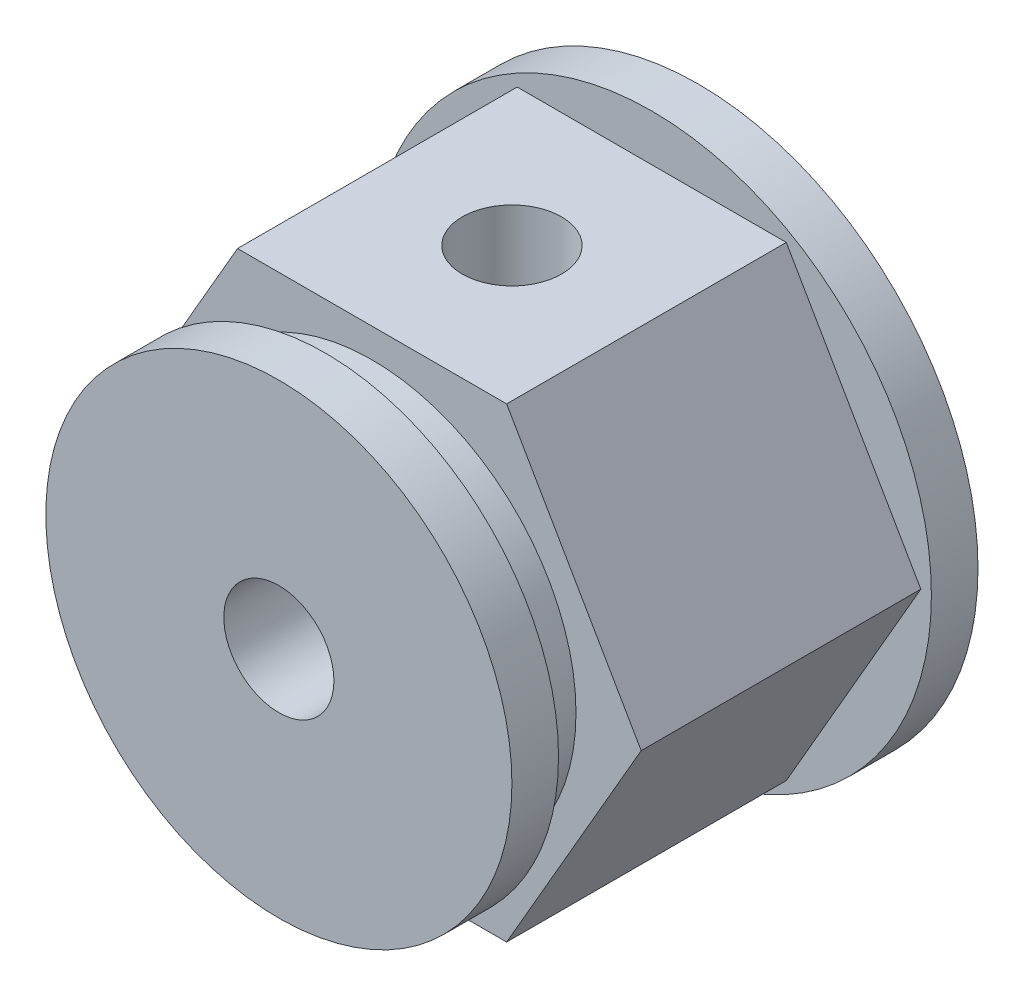
ISO-10303-21;
HEADER;
FILE_DESCRIPTION(('STEP AP214'),'2;1');
FILE_NAME('part.step','',(''),(''),'','','');
FILE_SCHEMA(('AUTOMOTIVE_DESIGN { 1 0 10303 214 1 1 1 1 }'));
ENDSEC;
DATA;
#1=APPLICATION_CONTEXT('core data for automotive mechanical design processes');
#2=APPLICATION_PROTOCOL_DEFINITION('international standard','automotive_design',2000,#1);
#3=PRODUCT_CONTEXT('',#1,'mechanical');
#4=PRODUCT('Part','Part','',(#3));
#5=PRODUCT_RELATED_PRODUCT_CATEGORY('part','',(#4));
#6=PRODUCT_DEFINITION_FORMATION('','',#4);
#7=PRODUCT_DEFINITION_CONTEXT('part definition',#1,'design');
#8=PRODUCT_DEFINITION('design','',#6,#7);
#9=PRODUCT_DEFINITION_SHAPE('','',#8);
#10=(LENGTH_UNIT() NAMED_UNIT(*) SI_UNIT(.MILLI.,.METRE.));
#11=(NAMED_UNIT(*) PLANE_ANGLE_UNIT() SI_UNIT($,.RADIAN.));
#12=(NAMED_UNIT(*) SI_UNIT($,.STERADIAN.) SOLID_ANGLE_UNIT());
#13=UNCERTAINTY_MEASURE_WITH_UNIT(LENGTH_MEASURE(1.E-05),#10,'distance_accuracy_value','');
#14=(GEOMETRIC_REPRESENTATION_CONTEXT(3) GLOBAL_UNCERTAINTY_ASSIGNED_CONTEXT((#13)) GLOBAL_UNIT_ASSIGNED_CONTEXT((#10,
#11,#12)) REPRESENTATION_CONTEXT('',''));
#15=CARTESIAN_POINT('',(0.,0.,0.));
#16=DIRECTION('',(0.,0.,1.));
#17=DIRECTION('',(1.,0.,0.));
#18=AXIS2_PLACEMENT_3D('',#15,#16,#17);
#19=CARTESIAN_POINT('',(0.,2.76865298486713,5.08));
#20=DIRECTION('',(0.,-1.,0.));
#21=DIRECTION('',(0.,0.,1.));
#22=AXIS2_PLACEMENT_3D('',#19,#20,#21);
#23=CYLINDRICAL_SURFACE('',#22,1.35255);
#24=CARTESIAN_POINT('',(0.,1.5,6.43255));
#25=CARTESIAN_POINT('',(0.0198043016052807,1.5000012819074,6.43255117812015));
#26=CARTESIAN_POINT('',(0.0396080438601034,1.4996078414155,6.43211425642976));
#27=CARTESIAN_POINT('',(0.0791950503795253,1.49803887260311,6.43037198525159));
#28=CARTESIAN_POINT('',(0.0989781454421765,1.49686142947436,6.42906450956719));
#29=CARTESIAN_POINT('',(0.138492623671168,1.49372507550479,6.42558141787046));
#30=CARTESIAN_POINT('',(0.158223406074362,1.49176278249477,6.42340204456182));
#31=CARTESIAN_POINT('',(0.19760276120761,1.48706043363353,6.41817713753683));
#32=CARTESIAN_POINT('',(0.217250060557923,1.48431561904379,6.41512630399209));
#33=CARTESIAN_POINT('',(0.256432099969215,1.47805256138358,6.40815989939859));
#34=CARTESIAN_POINT('',(0.275964677871483,1.47452829928225,6.40423759757071));
#35=CARTESIAN_POINT('',(0.314887307326208,1.46671190997784,6.39552964434572));
#36=CARTESIAN_POINT('',(0.334274127474943,1.46241265123441,6.39073597079771));
#37=CARTESIAN_POINT('',(0.372875423888603,1.45305293126775,6.38028662292672));
#38=CARTESIAN_POINT('',(0.392085455617645,1.44798439402331,6.37462179353452));
#39=CARTESIAN_POINT('',(0.430304294539741,1.43709362275101,6.36243078747414));
#40=CARTESIAN_POINT('',(0.449307350495095,1.43126254648774,6.35589448458764));
#41=CARTESIAN_POINT('',(0.482300456688254,1.42042632821454,6.3437263201414));
#42=CARTESIAN_POINT('',(0.496396147004403,1.41556022552104,6.33825546086535));
#43=CARTESIAN_POINT('',(0.524444235004841,1.40541211455407,6.32682734733487));
#44=CARTESIAN_POINT('',(0.538393179976172,1.40012600570037,6.32086526906656));
#45=CARTESIAN_POINT('',(0.572937415353485,1.38644901327173,6.30542230722188));
#46=CARTESIAN_POINT('',(0.593331821349381,1.37783829611338,6.29568489224132));
#47=CARTESIAN_POINT('',(0.633630617936896,1.35978170299198,6.27521646116172));
#48=CARTESIAN_POINT('',(0.653524804078469,1.3503261959149,6.264473896075));
#49=CARTESIAN_POINT('',(0.68881183482266,1.33261051335672,6.24427183167209));
#50=CARTESIAN_POINT('',(0.704343461583626,1.32446322819485,6.23495479150731));
#51=CARTESIAN_POINT('',(0.735057502597444,1.30766992030355,6.21568263168337));
#52=CARTESIAN_POINT('',(0.750233095828091,1.29901892476828,6.20572097588728));
#53=CARTESIAN_POINT('',(0.780220464280214,1.28123531728094,6.18515980324783));
#54=CARTESIAN_POINT('',(0.795024747324446,1.27209784029011,6.17455358006569));
#55=CARTESIAN_POINT('',(0.82425626505335,1.25335836808883,6.15270349830624));
#56=CARTESIAN_POINT('',(0.838675385315758,1.24375167803012,6.14145282012956));
#57=CARTESIAN_POINT('',(0.867123721564253,1.22409140244428,6.11831360718161));
#58=CARTESIAN_POINT('',(0.881144242989012,1.21403335479804,6.10641818534967));
#59=CARTESIAN_POINT('',(0.908784235998116,1.19348738338386,6.08199074755236));
#60=CARTESIAN_POINT('',(0.922394499464911,1.18299526867329,6.06945184632736));
#61=CARTESIAN_POINT('',(0.949200086175147,1.16160145160846,6.04373280471316));
#62=CARTESIAN_POINT('',(0.962385689710461,1.15069591954094,6.030545732083));
#63=CARTESIAN_POINT('',(0.988082730351917,1.12870596440796,6.00381785250258));
#64=CARTESIAN_POINT('',(1.00059676879007,1.11762248622387,5.99027876585789));
#65=CARTESIAN_POINT('',(1.02484049703905,1.0954305942161,5.96299381556672));
#66=CARTESIAN_POINT('',(1.03657869419811,1.0843246858452,5.94925347247297));
#67=CARTESIAN_POINT('',(1.05929325722631,1.06214236703778,5.92156148355833));
#68=CARTESIAN_POINT('',(1.07027779130942,1.05106759632086,5.90761522439048));
#69=CARTESIAN_POINT('',(1.09151271237718,1.02899534967393,5.87951284831704));
#70=CARTESIAN_POINT('',(1.10177083409789,1.01799876289964,5.865361877043));
#71=CARTESIAN_POINT('',(1.12158083688058,0.996128189900208,5.8368499761474));
#72=CARTESIAN_POINT('',(1.13113999399481,0.985254406799244,5.82249394620564));
#73=CARTESIAN_POINT('',(1.14958113241028,0.96367123911486,5.79357231259984));
#74=CARTESIAN_POINT('',(1.15846989623761,0.952961454747629,5.7790113319894));
#75=CARTESIAN_POINT('',(1.17559976864823,0.931745107035455,5.74967991531396));
#76=CARTESIAN_POINT('',(1.18384714328209,0.921237622393315,5.73491380576508));
#77=CARTESIAN_POINT('',(1.1997244139729,0.900461214402534,5.70517297543836));
#78=CARTESIAN_POINT('',(1.20736003804367,0.890190939648742,5.69020225551843));
#79=CARTESIAN_POINT('',(1.22204298862157,0.869922962857863,5.66005058682038));
#80=CARTESIAN_POINT('',(1.22909550507149,0.859923551485186,5.64487332055412));
#81=CARTESIAN_POINT('',(1.23928167502869,0.84511330254592,5.62190166327395));
#82=CARTESIAN_POINT('',(1.24260034645489,0.840225344418299,5.61423818900896));
#83=CARTESIAN_POINT('',(1.25150915664072,0.826938777236338,5.59314667975122));
#84=CARTESIAN_POINT('',(1.2569741931789,0.818602976236435,5.57962549437591));
#85=CARTESIAN_POINT('',(1.26733135925069,0.802471229137391,5.55273739850645));
#86=CARTESIAN_POINT('',(1.27223662496805,0.794666560936739,5.53938077837557));
#87=CARTESIAN_POINT('',(1.28299491732662,0.777210678012851,5.50857475815208));
#88=CARTESIAN_POINT('',(1.28872780030112,0.767655640684411,5.49102831667566));
#89=CARTESIAN_POINT('',(1.29930603956408,0.749605403393266,5.45620675095408));
#90=CARTESIAN_POINT('',(1.30417976539871,0.741081838292615,5.43895508997418));
#91=CARTESIAN_POINT('',(1.31149354928022,0.728022249953596,5.41090910279718));
#92=CARTESIAN_POINT('',(1.31413046143745,0.723248825595269,5.40027612058046));
#93=CARTESIAN_POINT('',(1.31910330883875,0.714137668819273,5.37912098476091));
#94=CARTESIAN_POINT('',(1.32144557491285,0.709791511512775,5.36860397264482));
#95=CARTESIAN_POINT('',(1.32526622543222,0.70262430901513,5.35040686826771));
#96=CARTESIAN_POINT('',(1.3268008088739,0.699721131758229,5.34277086635318));
#97=CARTESIAN_POINT('',(1.32972266789148,0.694152255605687,5.32753201243287));
#98=CARTESIAN_POINT('',(1.3311119554246,0.69148342992683,5.31993069047192));
#99=CARTESIAN_POINT('',(1.33417968392942,0.685550075152161,5.30227969633974));
#100=CARTESIAN_POINT('',(1.33581497775334,0.682356009045189,5.292198653663));
#101=CARTESIAN_POINT('',(1.3388407503713,0.676399576140629,5.27209607029078));
#102=CARTESIAN_POINT('',(1.34023545565437,0.673629879574626,5.26207734200368));
#103=CARTESIAN_POINT('',(1.34278848148376,0.668526056024184,5.24209977138248));
#104=CARTESIAN_POINT('',(1.34395069817624,0.666184818270616,5.23214325068439));
#105=CARTESIAN_POINT('',(1.34604585555983,0.66194113297451,5.21229062966108));
#106=CARTESIAN_POINT('',(1.34698233811784,0.660031940369563,5.20239635052323));
#107=CARTESIAN_POINT('',(1.34863191617234,0.656654731835217,5.18266872209471));
#108=CARTESIAN_POINT('',(1.34934816967627,0.655180492617422,5.17283670679596));
#109=CARTESIAN_POINT('',(1.35056206450247,0.652674517554949,5.15323409066074));
#110=CARTESIAN_POINT('',(1.35106244639562,0.651637238582134,5.14346437224063));
#111=CARTESIAN_POINT('',(1.35184768762463,0.650006647986499,5.12398685219492));
#112=CARTESIAN_POINT('',(1.35213484227799,0.649408608884469,5.11427954053773));
#113=CARTESIAN_POINT('',(1.35249712824189,0.648653756331364,5.09492704744616));
#114=CARTESIAN_POINT('',(1.35257406126698,0.648493193503439,5.08528204941777));
#115=CARTESIAN_POINT('',(1.35251533901269,0.648615644780297,5.06706949525997));
#116=CARTESIAN_POINT('',(1.35240239721329,0.648851266457452,5.05850152878047));
#117=CARTESIAN_POINT('',(1.35200440175386,0.649680160079745,5.04128873637168));
#118=CARTESIAN_POINT('',(1.35171739425256,0.650277492006385,5.03264415225381));
#119=CARTESIAN_POINT('',(1.35097130529613,0.651826111175588,5.0152779049176));
#120=CARTESIAN_POINT('',(1.35050997748867,0.65278201791377,5.00655675364839));
#121=CARTESIAN_POINT('',(1.34941295865474,0.65504677025406,4.98903708868512));
#122=CARTESIAN_POINT('',(1.34877473771342,0.65636073175628,4.9802393979012));
#123=CARTESIAN_POINT('',(1.34732115801376,0.659339432309617,4.96256633617975));
#124=CARTESIAN_POINT('',(1.34650301688089,0.661009667161826,4.95369212457888));
#125=CARTESIAN_POINT('',(1.34468584383717,0.664698640581927,4.93586568098452));
#126=CARTESIAN_POINT('',(1.34368379868215,0.66672315349988,4.92691495562501));
#127=CARTESIAN_POINT('',(1.34149423352171,0.671117994583737,4.90893513698875));
#128=CARTESIAN_POINT('',(1.34030349044922,0.673494273238104,4.89990789571219));
#129=CARTESIAN_POINT('',(1.33773108956135,0.678589596769083,4.88177470262445));
#130=CARTESIAN_POINT('',(1.33634601613673,0.68131467363588,4.8726709355971));
#131=CARTESIAN_POINT('',(1.3333786838864,0.687104133150473,4.85438436290561));
#132=CARTESIAN_POINT('',(1.33179283121298,0.690174542508535,4.84520405391418));
#133=CARTESIAN_POINT('',(1.32841685430131,0.696650765698789,4.82676409333771));
#134=CARTESIAN_POINT('',(1.32662296919862,0.7000625236012,4.81750722346823));
#135=CARTESIAN_POINT('',(1.32282304202601,0.707217065508615,4.79891385905461));
#136=CARTESIAN_POINT('',(1.32081308045461,0.710965643322516,4.78958040037251));
#137=CARTESIAN_POINT('',(1.31657235127114,0.718788914358811,4.77083363100933));
#138=CARTESIAN_POINT('',(1.31433751182233,0.722869192706257,4.76142357807994));
#139=CARTESIAN_POINT('',(1.30963758200456,0.7313504329152,4.74252333508561));
#140=CARTESIAN_POINT('',(1.3071682704543,0.735756723066062,4.73303658915556));
#141=CARTESIAN_POINT('',(1.30198939723451,0.744883774324634,4.71398305869675));
#142=CARTESIAN_POINT('',(1.29927547166372,0.749609561754022,4.70441988043519));
#143=CARTESIAN_POINT('',(1.29065214397637,0.764428261907697,4.67525626156706));
#144=CARTESIAN_POINT('',(1.28444043953183,0.77483585326703,4.65590347330322));
#145=CARTESIAN_POINT('',(1.27269935176141,0.793935454560764,4.62195142146459));
#146=CARTESIAN_POINT('',(1.26731532671469,0.802508383676479,4.60723361204987));
#147=CARTESIAN_POINT('',(1.2558867075397,0.820282922989082,4.57761758190022));
#148=CARTESIAN_POINT('',(1.24982502926573,0.829496057720495,4.56273288262524));
#149=CARTESIAN_POINT('',(1.23530883914099,0.851016295794938,4.52875776442154));
#150=CARTESIAN_POINT('',(1.22669287384834,0.863401376472312,4.50978587098233));
#151=CARTESIAN_POINT('',(1.2085848014403,0.888575416589408,4.47215407398884));
#152=CARTESIAN_POINT('',(1.19908335520945,0.901367449547476,4.45350072233575));
#153=CARTESIAN_POINT('',(1.18116057917947,0.924679764988164,4.42025924428924));
#154=CARTESIAN_POINT('',(1.17287839400876,0.935168490538685,4.40557374339136));
#155=CARTESIAN_POINT('',(1.15568553647824,0.956336213426378,4.37640698569156));
#156=CARTESIAN_POINT('',(1.14676886851523,0.967016026558123,4.36192985311533));
#157=CARTESIAN_POINT('',(1.12827902082529,0.988529198837881,4.33318024712576));
#158=CARTESIAN_POINT('',(1.11869934039061,0.999362883780402,4.31891219888702));
#159=CARTESIAN_POINT('',(1.09885635398568,1.02114368014686,4.29058035861464));
#160=CARTESIAN_POINT('',(1.08858606947675,1.03209054108243,4.27652126145949));
#161=CARTESIAN_POINT('',(1.06733574283405,1.05405451081149,4.24860679616932));
#162=CARTESIAN_POINT('',(1.05634827612519,1.06507071469575,4.2347563674821));
#163=CARTESIAN_POINT('',(1.03363765807575,1.08712789083767,4.20726019953809));
#164=CARTESIAN_POINT('',(1.02190666043177,1.09816724066712,4.19361963946943));
#165=CARTESIAN_POINT('',(0.997688056400445,1.12021893647813,4.1665383718344));
#166=CARTESIAN_POINT('',(0.985192273380789,1.13122883075961,4.15310297945109));
#167=CARTESIAN_POINT('',(0.959496330561451,1.15310613840585,4.12653745597137));
#168=CARTESIAN_POINT('',(0.946291613366013,1.16397187723702,4.11341034802439));
#169=CARTESIAN_POINT('',(0.919449815196238,1.18528523835287,4.08781011964112));
#170=CARTESIAN_POINT('',(0.905822405229338,1.19573671062958,4.07533007678394));
#171=CARTESIAN_POINT('',(0.878150224651369,1.21620062689703,4.05101916859661));
#172=CARTESIAN_POINT('',(0.864114611111726,1.22621727845493,4.03918143070919));
#173=CARTESIAN_POINT('',(0.835638239737467,1.2457941107893,4.0161564148494));
#174=CARTESIAN_POINT('',(0.821206123999407,1.25535876622903,4.00496226436812));
#175=CARTESIAN_POINT('',(0.791950812632659,1.27401363713904,3.98322405952432));
#176=CARTESIAN_POINT('',(0.77713567791265,1.28310855572057,3.97267320234246));
#177=CARTESIAN_POINT('',(0.747128841177312,1.30080663807806,3.95222158520962));
#178=CARTESIAN_POINT('',(0.73194457737925,1.30941467068665,3.94231413785603));
#179=CARTESIAN_POINT('',(0.701215465946889,1.32612177128421,3.92314920519291));
#180=CARTESIAN_POINT('',(0.685677385511577,1.33422581128062,3.91388520503692));
#181=CARTESIAN_POINT('',(0.650378247078611,1.35184424795138,3.89380091549264));
#182=CARTESIAN_POINT('',(0.630479111472819,1.36124547358101,3.88312307201122));
#183=CARTESIAN_POINT('',(0.590174099207604,1.37919351046998,3.86278208104245));
#184=CARTESIAN_POINT('',(0.569778326910911,1.38774993142369,3.85310743694907));
#185=CARTESIAN_POINT('',(0.535274891949801,1.40132051213356,3.83778627295874));
#186=CARTESIAN_POINT('',(0.5213677262253,1.40655569615344,3.8318821056695));
#187=CARTESIAN_POINT('',(0.493404704506742,1.41660511081878,3.82056624495937));
#188=CARTESIAN_POINT('',(0.479352223181732,1.42142337614337,3.8151498040824));
#189=CARTESIAN_POINT('',(0.446460722556179,1.43215206337048,3.80310387642852));
#190=CARTESIAN_POINT('',(0.427517314239405,1.43792412418467,3.79663459049605));
#191=CARTESIAN_POINT('',(0.389419888828194,1.44870256941769,3.78457107595193));
#192=CARTESIAN_POINT('',(0.370271476427311,1.453717633958,3.77896690726327));
#193=CARTESIAN_POINT('',(0.331795168686564,1.46297612349132,3.76863233439775));
#194=CARTESIAN_POINT('',(0.31247159548387,1.46722746360644,3.76389295843343));
#195=CARTESIAN_POINT('',(0.273676820497193,1.47495371200729,3.75528704552006));
#196=CARTESIAN_POINT('',(0.254208752711231,1.47843559590207,3.75141266324442));
#197=CARTESIAN_POINT('',(0.215156763575255,1.4846195902597,3.74453560445325));
#198=CARTESIAN_POINT('',(0.195574931020887,1.48732757232883,3.7415263629956));
#199=CARTESIAN_POINT('',(0.156327027913259,1.49196177681355,3.73637795882121));
#200=CARTESIAN_POINT('',(0.136662181208984,1.49389262384161,3.73423364885701));
#201=CARTESIAN_POINT('',(0.0972802838141776,1.49697195513292,3.73081475863572));
#202=CARTESIAN_POINT('',(0.0775638021634454,1.49812370145047,3.72953655201041));
#203=CARTESIAN_POINT('',(0.0381083647088152,1.49964546117419,3.72784416793708));
#204=CARTESIAN_POINT('',(0.0183695687512262,1.50001729276906,3.72742798092048));
#205=CARTESIAN_POINT('',(-0.0113498605961701,1.49999031527013,3.72746217778288));
#206=CARTESIAN_POINT('',(-0.021332864080873,1.49988151142485,3.72758598487384));
#207=CARTESIAN_POINT('',(-0.0413267020638518,1.49946404718255,3.72806445663431));
#208=CARTESIAN_POINT('',(-0.0513375017564251,1.49915464401861,3.72841997931207));
#209=CARTESIAN_POINT('',(-0.071382496461346,1.49833427237517,3.72935968833747));
#210=CARTESIAN_POINT('',(-0.0814166112387242,1.49782245656735,3.72994483584693));
#211=CARTESIAN_POINT('',(-0.101504204076359,1.49659568016429,3.73134423722685));
#212=CARTESIAN_POINT('',(-0.111557549560331,1.49587977100538,3.73215956070898));
#213=CARTESIAN_POINT('',(-0.131679567124692,1.49424325450683,3.73401909103989));
#214=CARTESIAN_POINT('',(-0.141748046513117,1.4933216008847,3.73506446738802));
#215=CARTESIAN_POINT('',(-0.161895520595683,1.49127227230342,3.7373839237884));
#216=CARTESIAN_POINT('',(-0.171974251061178,1.49014345853182,3.73865926731738));
#217=CARTESIAN_POINT('',(-0.202317960762714,1.48643368990878,3.74284196023739));
#218=CARTESIAN_POINT('',(-0.222501339675155,1.48354479402123,3.74608842765596));
#219=CARTESIAN_POINT('',(-0.250121658320806,1.47901937236198,3.7511537539763));
#220=CARTESIAN_POINT('',(-0.257685090843728,1.4777202452689,3.75260602283984));
#221=CARTESIAN_POINT('',(-0.272809086759644,1.47500323129489,3.75563933855301));
#222=CARTESIAN_POINT('',(-0.280369410190648,1.47358473616229,3.75722104367273));
#223=CARTESIAN_POINT('',(-0.300007859279864,1.46974396688159,3.76149807020585));
#224=CARTESIAN_POINT('',(-0.312048566822439,1.4672341377633,3.7642875944372));
#225=CARTESIAN_POINT('',(-0.336023918869398,1.4619299160969,3.77017759402991));
#226=CARTESIAN_POINT('',(-0.347958214940098,1.45913481475443,3.77327884360758));
#227=CARTESIAN_POINT('',(-0.378873976570539,1.45149566843273,3.78175519080589));
#228=CARTESIAN_POINT('',(-0.39773820541309,1.44643734954098,3.78736832487251));
#229=CARTESIAN_POINT('',(-0.435154983053928,1.4356259658032,3.79938889884391));
#230=CARTESIAN_POINT('',(-0.453704674650831,1.42986856021973,3.80580130885277));
#231=CARTESIAN_POINT('',(-0.485840600651097,1.41921496924437,3.8177025493119));
#232=CARTESIAN_POINT('',(-0.499530337708396,1.41445294508795,3.8230332364184));
#233=CARTESIAN_POINT('',(-0.526710320939546,1.40455931470185,3.83414499166314));
#234=CARTESIAN_POINT('',(-0.540198581088522,1.39942541829864,3.83992887244448));
#235=CARTESIAN_POINT('',(-0.574251736664847,1.38590462045743,3.85518825453165));
#236=CARTESIAN_POINT('',(-0.594604571831456,1.37728898706942,3.8649362493405));
#237=CARTESIAN_POINT('',(-0.634822010995911,1.35922528511426,3.88541806696321));
#238=CARTESIAN_POINT('',(-0.654676469315374,1.34976763876911,3.89616331359182));
#239=CARTESIAN_POINT('',(-0.689892137419002,1.33205119131964,3.91636825480741));
#240=CARTESIAN_POINT('',(-0.70539195086434,1.32390474763869,3.92568579963945));
#241=CARTESIAN_POINT('',(-0.736042807026803,1.30711518486429,3.94495648478601));
#242=CARTESIAN_POINT('',(-0.751187061133557,1.29846712737364,3.95491611807555));
#243=CARTESIAN_POINT('',(-0.781112191361702,1.28069146676493,3.97547104904298));
#244=CARTESIAN_POINT('',(-0.795885611675398,1.27155903374891,3.98607301211563));
#245=CARTESIAN_POINT('',(-0.825055973042096,1.25283167212603,4.00791230099775));
#246=CARTESIAN_POINT('',(-0.839444841414143,1.24323208322228,4.01915640355395));
#247=CARTESIAN_POINT('',(-0.867833335341112,1.22358799321762,4.04228021173761));
#248=CARTESIAN_POINT('',(-0.881824312623649,1.21353906354954,4.05416676146325));
#249=CARTESIAN_POINT('',(-0.909405970616828,1.19301327049878,4.07857420680038));
#250=CARTESIAN_POINT('',(-0.92298749360292,1.18253224830177,4.09110194492299));
#251=CARTESIAN_POINT('',(-0.949736470090433,1.16116249054801,4.11679637152259));
#252=CARTESIAN_POINT('',(-0.962894258488443,1.15026995508402,4.12996994915343));
#253=CARTESIAN_POINT('',(-0.988532106090114,1.12831187382036,4.15666381875755));
#254=CARTESIAN_POINT('',(-1.00101502295202,1.11724736346463,4.17018222149593));
#255=CARTESIAN_POINT('',(-1.02519944144372,1.09509415595794,4.19742475814452));
#256=CARTESIAN_POINT('',(-1.03690940891822,1.08400794502398,4.21114339904322));
#257=CARTESIAN_POINT('',(-1.05957036331905,1.06186544597861,4.2387908892977));
#258=CARTESIAN_POINT('',(-1.07052947902422,1.05081078454682,4.25271437870102));
#259=CARTESIAN_POINT('',(-1.09171627644825,1.02877891868814,4.28077015034556));
#260=CARTESIAN_POINT('',(-1.10195165656807,1.01780259538072,4.29489731146285));
#261=CARTESIAN_POINT('',(-1.12171877758457,0.995972425569486,4.32336046821929));
#262=CARTESIAN_POINT('',(-1.13125776116108,0.985118779079826,4.33769158744072));
#263=CARTESIAN_POINT('',(-1.14966092943811,0.963575644437347,4.3665624899956));
#264=CARTESIAN_POINT('',(-1.15853186781763,0.952885755785109,4.38109766874381));
#265=CARTESIAN_POINT('',(-1.17562861203264,0.931708332945584,4.41037579983674));
#266=CARTESIAN_POINT('',(-1.18386065539785,0.921219884603788,4.4251144507147));
#267=CARTESIAN_POINT('',(-1.20166572205252,0.897920960153874,4.45846779305908));
#268=CARTESIAN_POINT('',(-1.21109974666315,0.885143531255899,4.4771799980002));
#269=CARTESIAN_POINT('',(-1.22906672599706,0.860017672362848,4.51492400932669));
#270=CARTESIAN_POINT('',(-1.23760944610739,0.847665880308963,4.53394892518728));
#271=CARTESIAN_POINT('',(-1.25164537921015,0.826737658513324,4.56717394707523));
#272=CARTESIAN_POINT('',(-1.2573241226587,0.818069937726165,4.58123821774521));
#273=CARTESIAN_POINT('',(-1.26805896129256,0.801325134034601,4.60919604129519));
#274=CARTESIAN_POINT('',(-1.27313003743415,0.793238010990284,4.6230778026529));
#275=CARTESIAN_POINT('',(-1.28421852592348,0.775192701911478,4.65507017033398));
#276=CARTESIAN_POINT('',(-1.29010764255785,0.765338614609593,4.67328455538231));
#277=CARTESIAN_POINT('',(-1.30092764276838,0.746791148649633,4.70941063868895));
#278=CARTESIAN_POINT('',(-1.30589076351237,0.738064864878254,4.7272955882113));
#279=CARTESIAN_POINT('',(-1.3127531755049,0.725741154687109,4.75420831210191));
#280=CARTESIAN_POINT('',(-1.31490826251613,0.721827592187682,4.76302726695553));
#281=CARTESIAN_POINT('',(-1.31900988800879,0.714304430827211,4.78058541725771));
#282=CARTESIAN_POINT('',(-1.3209601438236,0.710689842717156,4.78932159616067));
#283=CARTESIAN_POINT('',(-1.3246598644228,0.703769340232416,4.80671374353512));
#284=CARTESIAN_POINT('',(-1.32641294009812,0.700458207274818,4.81536686410457));
#285=CARTESIAN_POINT('',(-1.32972541950529,0.694148913502533,4.83259290550819));
#286=CARTESIAN_POINT('',(-1.33128832457365,0.691145342548238,4.8411631651206));
#287=CARTESIAN_POINT('',(-1.33398727861786,0.685919039720142,4.85683019182187));
#288=CARTESIAN_POINT('',(-1.3351490045331,0.683654214802799,4.86390848457325));
#289=CARTESIAN_POINT('',(-1.33734577645617,0.679346756379493,4.87800885486033));
#290=CARTESIAN_POINT('',(-1.33838273196233,0.677300847852382,4.88502963761446));
#291=CARTESIAN_POINT('',(-1.34102735939015,0.672055970045065,4.90396669863276));
#292=CARTESIAN_POINT('',(-1.34253980260525,0.669026376884656,4.91594426481663));
#293=CARTESIAN_POINT('',(-1.34457025734705,0.664930884892068,4.93392975998958));
#294=CARTESIAN_POINT('',(-1.34520291302806,0.663649710405035,4.93987677148202));
#295=CARTESIAN_POINT('',(-1.34638708782777,0.661243971166853,4.95174483553461));
#296=CARTESIAN_POINT('',(-1.34693938985411,0.660117901878902,4.9576655039491));
#297=CARTESIAN_POINT('',(-1.34832541190069,0.65728420763314,4.97364613641207));
#298=CARTESIAN_POINT('',(-1.34908957750701,0.655713012274589,4.98373682502737));
#299=CARTESIAN_POINT('',(-1.35038683404729,0.653037194570785,5.0038416164727));
#300=CARTESIAN_POINT('',(-1.35092318725471,0.651925991449789,5.01385463209471));
#301=CARTESIAN_POINT('',(-1.35176844066068,0.650171533487276,5.03380386784343));
#302=CARTESIAN_POINT('',(-1.35208012574255,0.649522550425473,5.0437394625371));
#303=CARTESIAN_POINT('',(-1.35247954244837,0.648690452556213,5.0635335107986));
#304=CARTESIAN_POINT('',(-1.35256952636656,0.648502652587557,5.07339171727771));
#305=CARTESIAN_POINT('',(-1.35252573329701,0.648593966444835,5.09181707637155));
#306=CARTESIAN_POINT('',(-1.35241965680646,0.648815279221171,5.10038461775269));
#307=CARTESIAN_POINT('',(-1.35203561149509,0.649615197077095,5.11759642158084));
#308=CARTESIAN_POINT('',(-1.35175570791293,0.650197823610857,5.1262404528908));
#309=CARTESIAN_POINT('',(-1.35102382880439,0.651717218153708,5.14360542293399));
#310=CARTESIAN_POINT('',(-1.35056962176722,0.652658577685952,5.15232586247758));
#311=CARTESIAN_POINT('',(-1.34948695136191,0.654894290143474,5.16984393827249));
#312=CARTESIAN_POINT('',(-1.34885597275542,0.65619373342171,5.17864076624935));
#313=CARTESIAN_POINT('',(-1.34741700135886,0.659143504596315,5.19631193278232));
#314=CARTESIAN_POINT('',(-1.34660623944367,0.660799308098715,5.20518512768027));
#315=CARTESIAN_POINT('',(-1.34480398890793,0.664459528493902,5.22300936799425));
#316=CARTESIAN_POINT('',(-1.34380949932095,0.666469704110112,5.23195892290008));
#317=CARTESIAN_POINT('',(-1.34163524276667,0.670835997397419,5.24993623029791));
#318=CARTESIAN_POINT('',(-1.34045226401478,0.673198054614063,5.25896214677624));
#319=CARTESIAN_POINT('',(-1.33789562388596,0.678265076435268,5.27709252024287));
#320=CARTESIAN_POINT('',(-1.33651855733458,0.680976066438312,5.28619480782614));
#321=CARTESIAN_POINT('',(-1.33356750443962,0.686737510056226,5.30447825230069));
#322=CARTESIAN_POINT('',(-1.33198993394596,0.689793987813761,5.31365692691709));
#323=CARTESIAN_POINT('',(-1.32863081988064,0.696242523469496,5.33209345046715));
#324=CARTESIAN_POINT('',(-1.32684552452778,0.699640526487211,5.34134853083162));
#325=CARTESIAN_POINT('',(-1.32306310733399,0.706767753851639,5.35993814926456));
#326=CARTESIAN_POINT('',(-1.32106207457185,0.710502776252762,5.36926966318833));
#327=CARTESIAN_POINT('',(-1.31683956456974,0.718299152914947,5.38801237747186));
#328=CARTESIAN_POINT('',(-1.3146140236705,0.722366099320751,5.39742033027156));
#329=CARTESIAN_POINT('',(-1.30993308250432,0.73082091545648,5.41631620912547));
#330=CARTESIAN_POINT('',(-1.30747346891566,0.735214122874289,5.42580069968315));
#331=CARTESIAN_POINT('',(-1.30231441225526,0.744315272754251,5.4448495564608));
#332=CARTESIAN_POINT('',(-1.29961061289327,0.749028252926811,5.45441032351393));
#333=CARTESIAN_POINT('',(-1.29101879499945,0.763808370603705,5.48356610662001));
#334=CARTESIAN_POINT('',(-1.28482872838141,0.774191316716965,5.50291365139635));
#335=CARTESIAN_POINT('',(-1.27312695792198,0.793249272207196,5.53685611072327));
#336=CARTESIAN_POINT('',(-1.26776048675527,0.801804652447328,5.5515695576013));
#337=CARTESIAN_POINT('',(-1.25636815173864,0.819545015644803,5.5811764941763));
#338=CARTESIAN_POINT('',(-1.25032522656658,0.828741581433475,5.5960564663421));
#339=CARTESIAN_POINT('',(-1.23586125699656,0.850213072303581,5.63000126363438));
#340=CARTESIAN_POINT('',(-1.22727974640366,0.862566138600214,5.64894813088525));
#341=CARTESIAN_POINT('',(-1.20924232936988,0.887679619663376,5.68653423423949));
#342=CARTESIAN_POINT('',(-1.19977698503266,0.900443172967432,5.70516684200333));
#343=CARTESIAN_POINT('',(-1.18192089436562,0.923707249373111,5.73837437550819));
#344=CARTESIAN_POINT('',(-1.17366872496874,0.934175904731579,5.75304636213701));
#345=CARTESIAN_POINT('',(-1.15653690135786,0.955305972122128,5.78218886113563));
#346=CARTESIAN_POINT('',(-1.14765120053674,0.965968224587509,5.79665521158474));
#347=CARTESIAN_POINT('',(-1.12922422252747,0.987448867505076,5.82538602085702));
#348=CARTESIAN_POINT('',(-1.11967639392324,0.998267604275213,5.83964601829731));
#349=CARTESIAN_POINT('',(-1.09989796691043,1.0200211980978,5.8679645238041));
#350=CARTESIAN_POINT('',(-1.08966033975672,1.03095582108823,5.88201830273064));
#351=CARTESIAN_POINT('',(-1.06847608618315,1.05289810995699,5.90992489367854));
#352=CARTESIAN_POINT('',(-1.05752198556598,1.06390488345612,5.92377273417841));
#353=CARTESIAN_POINT('',(-1.03487875227593,1.08594608712295,5.95126649553832));
#354=CARTESIAN_POINT('',(-1.02318172430469,1.09697890375577,5.96490720753499));
#355=CARTESIAN_POINT('',(-0.999031565349599,1.11902052381292,5.99199150954194));
#356=CARTESIAN_POINT('',(-0.986570209451318,1.13002688087315,6.00542975728534));
#357=CARTESIAN_POINT('',(-0.960942442626376,1.15190091999988,6.03200474929636));
#358=CARTESIAN_POINT('',(-0.94777137573736,1.16276690211583,6.04513840893498));
#359=CARTESIAN_POINT('',(-0.920996851547552,1.18408319650777,6.07075381776164));
#360=CARTESIAN_POINT('',(-0.907403017221009,1.19453731726631,6.08324244389103));
#361=CARTESIAN_POINT('',(-0.879797799323321,1.21500896887605,6.10757255955871));
#362=CARTESIAN_POINT('',(-0.865795529300499,1.22503066456328,6.11942087634744));
#363=CARTESIAN_POINT('',(-0.837385519582888,1.24461999426902,6.14246910103825));
#364=CARTESIAN_POINT('',(-0.822986382792293,1.25419205978193,6.15367583571237));
#365=CARTESIAN_POINT('',(-0.793796561739557,1.27286412615352,6.17544125756141));
#366=CARTESIAN_POINT('',(-0.779013903976118,1.28196878693293,6.18600670207859));
#367=CARTESIAN_POINT('',(-0.749071415244233,1.29968868639881,6.20648954289449));
#368=CARTESIAN_POINT('',(-0.733918993066339,1.3083087512959,6.21641358182238));
#369=CARTESIAN_POINT('',(-0.703252819781686,1.32504219886027,6.23561374519556));
#370=CARTESIAN_POINT('',(-0.687745811659685,1.33316051208834,6.2448963410061));
#371=CARTESIAN_POINT('',(-0.652515351446272,1.35081359324545,6.26502479902986));
#372=CARTESIAN_POINT('',(-0.632653801795074,1.36023571745253,6.27572869221495));
#373=CARTESIAN_POINT('',(-0.592422350512653,1.37822890828003,6.29612498215936));
#374=CARTESIAN_POINT('',(-0.572062528537878,1.38680951375472,6.3058288010126));
#375=CARTESIAN_POINT('',(-0.537575313676728,1.4004399558443,6.32122034654486));
#376=CARTESIAN_POINT('',(-0.523647673596247,1.40570882219032,6.32716353492066));
#377=CARTESIAN_POINT('',(-0.495642582856921,1.41582398849534,6.33855537152583));
#378=CARTESIAN_POINT('',(-0.481568555081183,1.4206743589002,6.34400881146422));
#379=CARTESIAN_POINT('',(-0.448626049347969,1.43147579066134,6.35613837328014));
#380=CARTESIAN_POINT('',(-0.429652375159258,1.43728819026164,6.36265388002145));
#381=CARTESIAN_POINT('',(-0.391492740550835,1.44814431841501,6.37480613218416));
#382=CARTESIAN_POINT('',(-0.372312476741505,1.45319681804266,6.38045292546848));
#383=CARTESIAN_POINT('',(-0.333770984457149,1.46252713937164,6.39086904899052));
#384=CARTESIAN_POINT('',(-0.314414155869894,1.46681296797462,6.39564745794587));
#385=CARTESIAN_POINT('',(-0.275551601337532,1.47460513248787,6.40432772440013));
#386=CARTESIAN_POINT('',(-0.256049072180345,1.47811853434616,6.40823753142572));
#387=CARTESIAN_POINT('',(-0.216927052780095,1.48436245468799,6.4151817854681));
#388=CARTESIAN_POINT('',(-0.197309699595313,1.48709893168203,6.41822289599186));
#389=CARTESIAN_POINT('',(-0.157989994817134,1.49178712540914,6.42343118925524));
#390=CARTESIAN_POINT('',(-0.138288900122285,1.493743546891,6.42560361155185));
#391=CARTESIAN_POINT('',(-0.0988333995108877,1.49687060821828,6.42907562827917));
#392=CARTESIAN_POINT('',(-0.0790795851529433,1.49804458400326,6.43037892820687));
#393=CARTESIAN_POINT('',(-0.0395505871059099,1.49960897828975,6.43211565745122));
#394=CARTESIAN_POINT('',(-0.0197755690363866,1.50000127425414,6.43255117104405));
#395=CARTESIAN_POINT('',(0.,1.5,6.43255));
#396=B_SPLINE_CURVE_WITH_KNOTS('',3,(#24,#25,#26,#27,#28,#29,#30,#31,#32,#33,#34,#35,#36,#37,
#38,#39,#40,#41,#42,#43,#44,#45,#46,#47,#48,#49,#50,#51,#52,#53,#54,#55,#56,#57,#58,#59,#60,#61,
#62,#63,#64,#65,#66,#67,#68,#69,#70,#71,#72,#73,#74,#75,#76,#77,#78,#79,#80,#81,#82,#83,#84,#85,
#86,#87,#88,#89,#90,#91,#92,#93,#94,#95,#96,#97,#98,#99,#100,#101,#102,#103,#104,#105,#106,#107,
#108,#109,#110,#111,#112,#113,#114,#115,#116,#117,#118,#119,#120,#121,#122,#123,#124,#125,#126,
#127,#128,#129,#130,#131,#132,#133,#134,#135,#136,#137,#138,#139,#140,#141,#142,#143,#144,#145,
#146,#147,#148,#149,#150,#151,#152,#153,#154,#155,#156,#157,#158,#159,#160,#161,#162,#163,#164,
#165,#166,#167,#168,#169,#170,#171,#172,#173,#174,#175,#176,#177,#178,#179,#180,#181,#182,#183,
#184,#185,#186,#187,#188,#189,#190,#191,#192,#193,#194,#195,#196,#197,#198,#199,#200,#201,#202,
#203,#204,#205,#206,#207,#208,#209,#210,#211,#212,#213,#214,#215,#216,#217,#218,#219,#220,#221,
#222,#223,#224,#225,#226,#227,#228,#229,#230,#231,#232,#233,#234,#235,#236,#237,#238,#239,#240,
#241,#242,#243,#244,#245,#246,#247,#248,#249,#250,#251,#252,#253,#254,#255,#256,#257,#258,#259,
#260,#261,#262,#263,#264,#265,#266,#267,#268,#269,#270,#271,#272,#273,#274,#275,#276,#277,#278,
#279,#280,#281,#282,#283,#284,#285,#286,#287,#288,#289,#290,#291,#292,#293,#294,#295,#296,#297,
#298,#299,#300,#301,#302,#303,#304,#305,#306,#307,#308,#309,#310,#311,#312,#313,#314,#315,#316,
#317,#318,#319,#320,#321,#322,#323,#324,#325,#326,#327,#328,#329,#330,#331,#332,#333,#334,#335,
#336,#337,#338,#339,#340,#341,#342,#343,#344,#345,#346,#347,#348,#349,#350,#351,#352,#353,#354,
#355,#356,#357,#358,#359,#360,#361,#362,#363,#364,#365,#366,#367,#368,#369,#370,#371,#372,#373,
#374,#375,#376,#377,#378,#379,#380,#381,#382,#383,#384,#385,#386,#387,#388,#389,#390,#391,#392,
#393,#394,#395),.UNSPECIFIED.,.F.,.F.,(4,2,2,2,2,2,2,2,2,2,2,2,2,2,2,2,2,2,2,2,2,2,2,2,2,2,2,2,
2,2,2,2,2,2,2,2,2,2,2,2,2,2,2,2,2,2,2,2,2,2,2,2,2,2,2,2,2,2,2,2,2,2,2,2,2,2,2,2,2,2,2,2,2,2,2,2,
2,2,2,2,2,2,2,2,2,2,2,2,2,2,2,2,2,2,2,2,2,2,2,2,2,2,2,2,2,2,2,2,2,2,2,2,2,2,2,2,2,2,2,2,2,2,2,2,
2,2,2,2,2,2,2,2,2,2,2,2,2,2,2,2,2,2,2,2,2,2,2,2,2,2,2,2,2,2,2,2,2,2,2,2,2,2,2,2,2,2,2,2,2,2,2,2,
2,2,2,2,2,2,2,2,2,2,2,2,2,4),(0.,0.0594033086551323,0.118952235725,0.178760591703973,
0.238940715236428,0.299602879602633,0.360854754647714,0.422800935330774,0.485542544328552,
0.53318194403161,0.581363129886104,0.653875550211374,0.727357973017922,0.786919907258936,
0.84722870979255,0.908337180469658,0.970296074805685,1.03315408829658,1.09695785783232,
1.1617519781568,1.2262736840263,1.28989517153715,1.3526545072609,1.41459134905319,
1.47574695647298,1.53616419118367,1.59588750609741,1.65496292208312,1.71343799116556,
1.74246663356416,1.79285136949709,1.84152927928547,1.90386250488321,1.96338402506529,
1.99922718495205,2.03407353735036,2.05900671751627,2.08352871483358,2.11562132978735,
2.14707489763876,2.17794651211134,2.20829655176475,2.23818855622594,2.26768902515433,
2.29686713556936,2.32579437739121,2.35150121445034,2.37750208657539,2.40385012035493,
2.43059637366288,2.45778966127975,2.48547643344052,2.51370070385497,2.54250402212628,
2.57192548450801,2.60200177652177,2.63276724100081,2.6642539655069,2.69649188367029,
2.72950888572423,2.79797601005364,2.85155456309556,2.90711835019334,2.97981663931638,
3.0533944974738,3.11295296557828,3.17317787875866,3.23411282847625,3.29579989959251,
3.3582796557537,3.42159113557115,3.48577185849425,3.55043114104251,3.61410386339955,
3.67683460297316,3.73866997444058,3.7996586455453,3.85985133781636,3.91930081017099,
3.99264771573255,4.06503013016401,4.11298804852053,4.16041251242721,4.22288000039797,
4.28456553361127,4.34556936167814,4.40599512726192,4.46594947097888,4.52554156434075,
4.58488257822274,4.64408509795299,4.67403437227499,4.70409517920601,4.73428318009221,
4.76461383924884,4.79510240391547,4.82576388576405,4.88765764865716,4.91108773908934,
4.93464543350383,4.97247291801865,5.01039678993055,5.07132866879498,5.13266034627775,
5.17897916758991,5.22561253321053,5.29803776668424,5.37142990925576,5.43091694381911,
5.4911481423031,5.55217600831539,5.61405101748046,5.67682160182337,5.7405341510517,
5.80523302871497,5.86963213707083,5.93313372367136,5.99577564403148,6.05759733449853,
6.11863982273017,6.17894572826744,6.2385592519767,6.31217049507344,6.3848642432243,
6.43726340327295,6.4877943435049,6.55235841829026,6.61385433631378,6.64350888554279,
6.67246472871591,6.70074820683296,6.72838758354118,6.75095050460575,6.7731057869832,
6.81042710919752,6.82877407400423,6.84692819988221,6.87763814084814,6.9078921378904,
6.93776435094089,6.96733181295715,6.99303597475143,7.01903149180947,7.04537155968131,
7.0721073172885,7.09928767010916,7.12695916630782,7.15516592246243,7.18394959389255,
7.21334938357896,7.24340208322155,7.2741421400042,7.30560174300164,7.33781092375539,
7.37079766626117,7.43920004023938,7.49272667268136,7.54823593353424,7.62078973463431,
7.69423388352012,7.75369306996116,7.81382546012311,7.87467455832034,7.93628234920424,
7.99868928479192,8.06193428225981,8.12605473137386,8.19066465041554,8.25429190940276,
8.31698088487926,8.37877797476485,8.43973161372016,8.49989227359476,8.55931244695233,
8.6326261559809,8.70497861430708,8.7530663111269,8.80061564221726,8.86324225052568,
8.9250788982427,8.98622631185601,9.04678865692595,9.10687314200489,9.16658954939926,
9.22604970021506,9.2853668648139),.UNSPECIFIED.);
#397=CARTESIAN_POINT('',(0.,1.5,6.43255));
#398=VERTEX_POINT('',#397);
#399=EDGE_CURVE('E191',#398,#398,#396,.T.);
#400=ORIENTED_EDGE('',*,*,#399,.F.);
#401=EDGE_LOOP('',(#400));
#402=FACE_BOUND('',#401,.T.);
#403=CARTESIAN_POINT('',(0.,6.35,5.08));
#404=DIRECTION('',(0.,1.,0.));
#405=DIRECTION('',(0.,0.,1.));
#406=AXIS2_PLACEMENT_3D('',#403,#404,#405);
#407=CIRCLE('',#406,1.35255);
#408=CARTESIAN_POINT('',(0.,6.35,6.43255));
#409=VERTEX_POINT('',#408);
#410=EDGE_CURVE('E11',#409,#409,#407,.T.);
#411=ORIENTED_EDGE('',*,*,#410,.T.);
#412=EDGE_LOOP('',(#411));
#413=FACE_BOUND('',#412,.T.);
#414=ADVANCED_FACE('F16',(#402,#413),#23,.F.);
#415=CARTESIAN_POINT('',(0.,6.35,8.89));
#416=DIRECTION('',(0.,-1.,0.));
#417=DIRECTION('',(0.,0.,-1.));
#418=AXIS2_PLACEMENT_3D('',#415,#416,#417);
#419=PLANE('',#418);
#420=ORIENTED_EDGE('',*,*,#410,.F.);
#421=EDGE_LOOP('',(#420));
#422=FACE_BOUND('',#421,.T.);
#423=DIRECTION('',(-1.,0.,0.));
#424=VECTOR('',#423,1.);
#425=CARTESIAN_POINT('',(0.,6.35,1.27));
#426=LINE('',#425,#424);
#427=CARTESIAN_POINT('',(3.66617420935413,6.35,1.27));
#428=VERTEX_POINT('',#427);
#429=CARTESIAN_POINT('',(-3.66617420935413,6.35,1.27));
#430=VERTEX_POINT('',#429);
#431=EDGE_CURVE('E173',#428,#430,#426,.T.);
#432=ORIENTED_EDGE('',*,*,#431,.T.);
#433=DIRECTION('',(0.,0.,-1.));
#434=VECTOR('',#433,1.);
#435=CARTESIAN_POINT('',(-3.66617420935413,6.35,8.89));
#436=LINE('',#435,#434);
#437=CARTESIAN_POINT('',(-3.66617420935413,6.35,8.89));
#438=VERTEX_POINT('',#437);
#439=EDGE_CURVE('E29',#438,#430,#436,.T.);
#440=ORIENTED_EDGE('',*,*,#439,.F.);
#441=DIRECTION('',(-1.,0.,0.));
#442=VECTOR('',#441,1.);
#443=CARTESIAN_POINT('',(0.,6.35,8.89));
#444=LINE('',#443,#442);
#445=CARTESIAN_POINT('',(3.66617420935413,6.35,8.89));
#446=VERTEX_POINT('',#445);
#447=EDGE_CURVE('E131',#446,#438,#444,.T.);
#448=ORIENTED_EDGE('',*,*,#447,.F.);
#449=DIRECTION('',(0.,0.,-1.));
#450=VECTOR('',#449,1.);
#451=CARTESIAN_POINT('',(3.66617420935413,6.35,8.89));
#452=LINE('',#451,#450);
#453=EDGE_CURVE('E136',#446,#428,#452,.T.);
#454=ORIENTED_EDGE('',*,*,#453,.T.);
#455=EDGE_LOOP('',(#432,#440,#448,#454));
#456=FACE_BOUND('',#455,.T.);
#457=ADVANCED_FACE('F134',(#422,#456),#419,.F.);
#458=CARTESIAN_POINT('',(-5.49926131403119,3.175,8.89));
#459=DIRECTION('',(0.866025403784439,-0.5,0.));
#460=DIRECTION('',(0.,0.,-1.));
#461=AXIS2_PLACEMENT_3D('',#458,#459,#460);
#462=PLANE('',#461);
#463=DIRECTION('',(-0.5,-0.866025403784439,0.));
#464=VECTOR('',#463,1.);
#465=CARTESIAN_POINT('',(-5.49926131403119,3.175,1.27));
#466=LINE('',#465,#464);
#467=CARTESIAN_POINT('',(-7.33234841870825,0.,1.27));
#468=VERTEX_POINT('',#467);
#469=EDGE_CURVE('E177',#430,#468,#466,.T.);
#470=ORIENTED_EDGE('',*,*,#469,.T.);
#471=DIRECTION('',(0.,0.,-1.));
#472=VECTOR('',#471,1.);
#473=CARTESIAN_POINT('',(-7.33234841870825,0.,8.89));
#474=LINE('',#473,#472);
#475=CARTESIAN_POINT('',(-7.33234841870825,0.,8.89));
#476=VERTEX_POINT('',#475);
#477=EDGE_CURVE('E216',#476,#468,#474,.T.);
#478=ORIENTED_EDGE('',*,*,#477,.F.);
#479=DIRECTION('',(-0.5,-0.866025403784439,0.));
#480=VECTOR('',#479,1.);
#481=CARTESIAN_POINT('',(-5.49926131403119,3.175,8.89));
#482=LINE('',#481,#480);
#483=EDGE_CURVE('E142',#438,#476,#482,.T.);
#484=ORIENTED_EDGE('',*,*,#483,.F.);
#485=ORIENTED_EDGE('',*,*,#439,.T.);
#486=EDGE_LOOP('',(#470,#478,#484,#485));
#487=FACE_BOUND('',#486,.T.);
#488=ADVANCED_FACE('F269',(#487),#462,.F.);
#489=CARTESIAN_POINT('',(-5.49926131403119,-3.175,8.89));
#490=DIRECTION('',(0.866025403784439,0.5,0.));
#491=DIRECTION('',(0.,0.,-1.));
#492=AXIS2_PLACEMENT_3D('',#489,#490,#491);
#493=PLANE('',#492);
#494=DIRECTION('',(0.5,-0.866025403784439,0.));
#495=VECTOR('',#494,1.);
#496=CARTESIAN_POINT('',(-5.49926131403119,-3.175,1.27));
#497=LINE('',#496,#495);
#498=CARTESIAN_POINT('',(-3.66617420935413,-6.35,1.27));
#499=VERTEX_POINT('',#498);
#500=EDGE_CURVE('E224',#468,#499,#497,.T.);
#501=ORIENTED_EDGE('',*,*,#500,.T.);
#502=DIRECTION('',(0.,0.,-1.));
#503=VECTOR('',#502,1.);
#504=CARTESIAN_POINT('',(-3.66617420935413,-6.35,8.89));
#505=LINE('',#504,#503);
#506=CARTESIAN_POINT('',(-3.66617420935413,-6.35,8.89));
#507=VERTEX_POINT('',#506);
#508=EDGE_CURVE('E169',#507,#499,#505,.T.);
#509=ORIENTED_EDGE('',*,*,#508,.F.);
#510=DIRECTION('',(0.5,-0.866025403784439,0.));
#511=VECTOR('',#510,1.);
#512=CARTESIAN_POINT('',(-5.49926131403119,-3.175,8.89));
#513=LINE('',#512,#511);
#514=EDGE_CURVE('E180',#476,#507,#513,.T.);
#515=ORIENTED_EDGE('',*,*,#514,.F.);
#516=ORIENTED_EDGE('',*,*,#477,.T.);
#517=EDGE_LOOP('',(#501,#509,#515,#516));
#518=FACE_BOUND('',#517,.T.);
#519=ADVANCED_FACE('F309',(#518),#493,.F.);
#520=CARTESIAN_POINT('',(0.,-6.35,8.89));
#521=DIRECTION('',(0.,1.,0.));
#522=DIRECTION('',(1.,0.,0.));
#523=AXIS2_PLACEMENT_3D('',#520,#521,#522);
#524=PLANE('',#523);
#525=DIRECTION('',(1.,0.,0.));
#526=VECTOR('',#525,1.);
#527=CARTESIAN_POINT('',(0.,-6.35,1.27));
#528=LINE('',#527,#526);
#529=CARTESIAN_POINT('',(3.66617420935412,-6.35,1.27));
#530=VERTEX_POINT('',#529);
#531=EDGE_CURVE('E222',#499,#530,#528,.T.);
#532=ORIENTED_EDGE('',*,*,#531,.T.);
#533=DIRECTION('',(0.,0.,-1.));
#534=VECTOR('',#533,1.);
#535=CARTESIAN_POINT('',(3.66617420935412,-6.35,8.89));
#536=LINE('',#535,#534);
#537=CARTESIAN_POINT('',(3.66617420935412,-6.35,8.89));
#538=VERTEX_POINT('',#537);
#539=EDGE_CURVE('E47',#538,#530,#536,.T.);
#540=ORIENTED_EDGE('',*,*,#539,.F.);
#541=DIRECTION('',(1.,0.,0.));
#542=VECTOR('',#541,1.);
#543=CARTESIAN_POINT('',(0.,-6.35,8.89));
#544=LINE('',#543,#542);
#545=EDGE_CURVE('E183',#507,#538,#544,.T.);
#546=ORIENTED_EDGE('',*,*,#545,.F.);
#547=ORIENTED_EDGE('',*,*,#508,.T.);
#548=EDGE_LOOP('',(#532,#540,#546,#547));
#549=FACE_BOUND('',#548,.T.);
#550=ADVANCED_FACE('F305',(#549),#524,.F.);
#551=CARTESIAN_POINT('',(5.49926131403118,-3.175,8.89));
#552=DIRECTION('',(-0.866025403784439,0.5,0.));
#553=DIRECTION('',(0.,0.,1.));
#554=AXIS2_PLACEMENT_3D('',#551,#552,#553);
#555=PLANE('',#554);
#556=DIRECTION('',(0.5,0.866025403784439,0.));
#557=VECTOR('',#556,1.);
#558=CARTESIAN_POINT('',(5.49926131403118,-3.175,1.27));
#559=LINE('',#558,#557);
#560=CARTESIAN_POINT('',(7.33234841870825,0.,1.27));
#561=VERTEX_POINT('',#560);
#562=EDGE_CURVE('E219',#530,#561,#559,.T.);
#563=ORIENTED_EDGE('',*,*,#562,.T.);
#564=DIRECTION('',(0.,0.,-1.));
#565=VECTOR('',#564,1.);
#566=CARTESIAN_POINT('',(7.33234841870825,0.,8.89));
#567=LINE('',#566,#565);
#568=CARTESIAN_POINT('',(7.33234841870825,0.,8.89));
#569=VERTEX_POINT('',#568);
#570=EDGE_CURVE('E154',#569,#561,#567,.T.);
#571=ORIENTED_EDGE('',*,*,#570,.F.);
#572=DIRECTION('',(0.5,0.866025403784439,0.));
#573=VECTOR('',#572,1.);
#574=CARTESIAN_POINT('',(5.49926131403118,-3.175,8.89));
#575=LINE('',#574,#573);
#576=EDGE_CURVE('E149',#538,#569,#575,.T.);
#577=ORIENTED_EDGE('',*,*,#576,.F.);
#578=ORIENTED_EDGE('',*,*,#539,.T.);
#579=EDGE_LOOP('',(#563,#571,#577,#578));
#580=FACE_BOUND('',#579,.T.);
#581=ADVANCED_FACE('F302',(#580),#555,.F.);
#582=CARTESIAN_POINT('',(0.,0.,8.89));
#583=DIRECTION('',(0.,0.,1.));
#584=DIRECTION('',(1.,0.,0.));
#585=AXIS2_PLACEMENT_3D('',#582,#583,#584);
#586=PLANE('',#585);
#587=CARTESIAN_POINT('',(0.,0.,8.89));
#588=DIRECTION('',(0.,0.,1.));
#589=DIRECTION('',(1.,0.,0.));
#590=AXIS2_PLACEMENT_3D('',#587,#588,#589);
#591=CIRCLE('',#590,5.55625);
#592=CARTESIAN_POINT('',(5.55625,0.,8.89));
#593=VERTEX_POINT('',#592);
#594=EDGE_CURVE('E143',#593,#593,#591,.T.);
#595=ORIENTED_EDGE('',*,*,#594,.F.);
#596=EDGE_LOOP('',(#595));
#597=FACE_BOUND('',#596,.T.);
#598=DIRECTION('',(-0.5,0.866025403784439,0.));
#599=VECTOR('',#598,1.);
#600=CARTESIAN_POINT('',(5.49926131403119,3.175,8.89));
#601=LINE('',#600,#599);
#602=EDGE_CURVE('E146',#569,#446,#601,.T.);
#603=ORIENTED_EDGE('',*,*,#602,.T.);
#604=ORIENTED_EDGE('',*,*,#447,.T.);
#605=ORIENTED_EDGE('',*,*,#483,.T.);
#606=ORIENTED_EDGE('',*,*,#514,.T.);
#607=ORIENTED_EDGE('',*,*,#545,.T.);
#608=ORIENTED_EDGE('',*,*,#576,.T.);
#609=EDGE_LOOP('',(#603,#604,#605,#606,#607,#608));
#610=FACE_BOUND('',#609,.T.);
#611=ADVANCED_FACE('F147',(#597,#610),#586,.T.);
#612=CARTESIAN_POINT('',(0.,0.,10.16));
#613=DIRECTION('',(0.,0.,1.));
#614=DIRECTION('',(-1.,0.,0.));
#615=AXIS2_PLACEMENT_3D('',#612,#613,#614);
#616=CYLINDRICAL_SURFACE('',#615,5.55625);
#617=CARTESIAN_POINT('',(0.,0.,10.16));
#618=DIRECTION('',(0.,0.,1.));
#619=DIRECTION('',(1.,0.,0.));
#620=AXIS2_PLACEMENT_3D('',#617,#618,#619);
#621=CIRCLE('',#620,5.55625);
#622=CARTESIAN_POINT('',(5.55625,0.,10.16));
#623=VERTEX_POINT('',#622);
#624=EDGE_CURVE('E172',#623,#623,#621,.T.);
#625=ORIENTED_EDGE('',*,*,#624,.F.);
#626=EDGE_LOOP('',(#625));
#627=FACE_BOUND('',#626,.T.);
#628=ORIENTED_EDGE('',*,*,#594,.T.);
#629=EDGE_LOOP('',(#628));
#630=FACE_BOUND('',#629,.T.);
#631=ADVANCED_FACE('F262',(#627,#630),#616,.T.);
#632=CARTESIAN_POINT('',(0.,0.,11.43));
#633=DIRECTION('',(0.,0.,1.));
#634=DIRECTION('',(-1.,0.,0.));
#635=AXIS2_PLACEMENT_3D('',#632,#633,#634);
#636=CYLINDRICAL_SURFACE('',#635,6.35);
#637=CARTESIAN_POINT('',(0.,0.,11.43));
#638=DIRECTION('',(0.,0.,1.));
#639=DIRECTION('',(1.,0.,0.));
#640=AXIS2_PLACEMENT_3D('',#637,#638,#639);
#641=CIRCLE('',#640,6.35);
#642=CARTESIAN_POINT('',(6.35,0.,11.43));
#643=VERTEX_POINT('',#642);
#644=EDGE_CURVE('E201',#643,#643,#641,.T.);
#645=ORIENTED_EDGE('',*,*,#644,.F.);
#646=EDGE_LOOP('',(#645));
#647=FACE_BOUND('',#646,.T.);
#648=CARTESIAN_POINT('',(0.,0.,10.16));
#649=DIRECTION('',(0.,0.,1.));
#650=DIRECTION('',(1.,0.,0.));
#651=AXIS2_PLACEMENT_3D('',#648,#649,#650);
#652=CIRCLE('',#651,6.35);
#653=CARTESIAN_POINT('',(6.35,0.,10.16));
#654=VERTEX_POINT('',#653);
#655=EDGE_CURVE('E206',#654,#654,#652,.T.);
#656=ORIENTED_EDGE('',*,*,#655,.T.);
#657=EDGE_LOOP('',(#656));
#658=FACE_BOUND('',#657,.T.);
#659=ADVANCED_FACE('F248',(#647,#658),#636,.T.);
#660=CARTESIAN_POINT('',(0.,0.,10.16));
#661=DIRECTION('',(0.,0.,1.));
#662=DIRECTION('',(1.,0.,0.));
#663=AXIS2_PLACEMENT_3D('',#660,#661,#662);
#664=PLANE('',#663);
#665=ORIENTED_EDGE('',*,*,#624,.T.);
#666=EDGE_LOOP('',(#665));
#667=FACE_BOUND('',#666,.T.);
#668=ORIENTED_EDGE('',*,*,#655,.F.);
#669=EDGE_LOOP('',(#668));
#670=FACE_BOUND('',#669,.T.);
#671=ADVANCED_FACE('F250',(#667,#670),#664,.F.);
#672=CARTESIAN_POINT('',(0.,0.,11.43));
#673=DIRECTION('',(0.,0.,1.));
#674=DIRECTION('',(1.,0.,0.));
#675=AXIS2_PLACEMENT_3D('',#672,#673,#674);
#676=PLANE('',#675);
#677=CARTESIAN_POINT('',(0.,0.,11.43));
#678=DIRECTION('',(0.,0.,1.));
#679=DIRECTION('',(1.,0.,0.));
#680=AXIS2_PLACEMENT_3D('',#677,#678,#679);
#681=CIRCLE('',#680,1.5);
#682=CARTESIAN_POINT('',(1.5,0.,11.43));
#683=VERTEX_POINT('',#682);
#684=EDGE_CURVE('E176',#683,#683,#681,.T.);
#685=ORIENTED_EDGE('',*,*,#684,.F.);
#686=EDGE_LOOP('',(#685));
#687=FACE_BOUND('',#686,.T.);
#688=ORIENTED_EDGE('',*,*,#644,.T.);
#689=EDGE_LOOP('',(#688));
#690=FACE_BOUND('',#689,.T.);
#691=ADVANCED_FACE('F252',(#687,#690),#676,.T.);
#692=CARTESIAN_POINT('',(0.,0.,-13.4165488088898));
#693=DIRECTION('',(0.,0.,-1.));
#694=DIRECTION('',(1.,0.,0.));
#695=AXIS2_PLACEMENT_3D('',#692,#693,#694);
#696=CYLINDRICAL_SURFACE('',#695,1.5);
#697=ORIENTED_EDGE('',*,*,#399,.T.);
#698=EDGE_LOOP('',(#697));
#699=FACE_BOUND('',#698,.T.);
#700=CARTESIAN_POINT('',(0.,0.,0.));
#701=DIRECTION('',(0.,0.,-1.));
#702=DIRECTION('',(1.,0.,0.));
#703=AXIS2_PLACEMENT_3D('',#700,#701,#702);
#704=CIRCLE('',#703,1.5);
#705=CARTESIAN_POINT('',(1.5,0.,0.));
#706=VERTEX_POINT('',#705);
#707=EDGE_CURVE('E164',#706,#706,#704,.T.);
#708=ORIENTED_EDGE('',*,*,#707,.T.);
#709=EDGE_LOOP('',(#708));
#710=FACE_BOUND('',#709,.T.);
#711=ORIENTED_EDGE('',*,*,#684,.T.);
#712=EDGE_LOOP('',(#711));
#713=FACE_BOUND('',#712,.T.);
#714=ADVANCED_FACE('F18',(#699,#710,#713),#696,.F.);
#715=CARTESIAN_POINT('',(0.,0.,1.27));
#716=DIRECTION('',(0.,0.,1.));
#717=DIRECTION('',(1.,0.,0.));
#718=AXIS2_PLACEMENT_3D('',#715,#716,#717);
#719=PLANE('',#718);
#720=DIRECTION('',(-0.5,0.866025403784439,0.));
#721=VECTOR('',#720,1.);
#722=CARTESIAN_POINT('',(5.49926131403119,3.175,1.27));
#723=LINE('',#722,#721);
#724=EDGE_CURVE('E158',#561,#428,#723,.T.);
#725=ORIENTED_EDGE('',*,*,#724,.F.);
#726=ORIENTED_EDGE('',*,*,#562,.F.);
#727=ORIENTED_EDGE('',*,*,#531,.F.);
#728=ORIENTED_EDGE('',*,*,#500,.F.);
#729=ORIENTED_EDGE('',*,*,#469,.F.);
#730=ORIENTED_EDGE('',*,*,#431,.F.);
#731=EDGE_LOOP('',(#725,#726,#727,#728,#729,#730));
#732=FACE_BOUND('',#731,.T.);
#733=CARTESIAN_POINT('',(0.,0.,1.27));
#734=DIRECTION('',(0.,0.,1.));
#735=DIRECTION('',(1.,0.,0.));
#736=AXIS2_PLACEMENT_3D('',#733,#734,#735);
#737=CIRCLE('',#736,7.62);
#738=CARTESIAN_POINT('',(7.62,0.,1.27));
#739=VERTEX_POINT('',#738);
#740=EDGE_CURVE('E184',#739,#739,#737,.T.);
#741=ORIENTED_EDGE('',*,*,#740,.T.);
#742=EDGE_LOOP('',(#741));
#743=FACE_BOUND('',#742,.T.);
#744=ADVANCED_FACE('F274',(#732,#743),#719,.T.);
#745=CARTESIAN_POINT('',(5.49926131403119,3.175,8.89));
#746=DIRECTION('',(-0.866025403784439,-0.5,0.));
#747=DIRECTION('',(-0.5,0.866025403784439,0.));
#748=AXIS2_PLACEMENT_3D('',#745,#746,#747);
#749=PLANE('',#748);
#750=ORIENTED_EDGE('',*,*,#724,.T.);
#751=ORIENTED_EDGE('',*,*,#453,.F.);
#752=ORIENTED_EDGE('',*,*,#602,.F.);
#753=ORIENTED_EDGE('',*,*,#570,.T.);
#754=EDGE_LOOP('',(#750,#751,#752,#753));
#755=FACE_BOUND('',#754,.T.);
#756=ADVANCED_FACE('F156',(#755),#749,.F.);
#757=CARTESIAN_POINT('',(0.,0.,0.));
#758=DIRECTION('',(0.,0.,1.));
#759=DIRECTION('',(1.,0.,0.));
#760=AXIS2_PLACEMENT_3D('',#757,#758,#759);
#761=PLANE('',#760);
#762=ORIENTED_EDGE('',*,*,#707,.F.);
#763=EDGE_LOOP('',(#762));
#764=FACE_BOUND('',#763,.T.);
#765=CARTESIAN_POINT('',(0.,0.,0.));
#766=DIRECTION('',(0.,0.,1.));
#767=DIRECTION('',(1.,0.,0.));
#768=AXIS2_PLACEMENT_3D('',#765,#766,#767);
#769=CIRCLE('',#768,7.62);
#770=CARTESIAN_POINT('',(7.62,0.,0.));
#771=VERTEX_POINT('',#770);
#772=EDGE_CURVE('E187',#771,#771,#769,.T.);
#773=ORIENTED_EDGE('',*,*,#772,.F.);
#774=EDGE_LOOP('',(#773));
#775=FACE_BOUND('',#774,.T.);
#776=ADVANCED_FACE('F281',(#764,#775),#761,.F.);
#777=CARTESIAN_POINT('',(0.,0.,1.27));
#778=DIRECTION('',(0.,0.,1.));
#779=DIRECTION('',(-1.,0.,0.));
#780=AXIS2_PLACEMENT_3D('',#777,#778,#779);
#781=CYLINDRICAL_SURFACE('',#780,7.62);
#782=ORIENTED_EDGE('',*,*,#740,.F.);
#783=EDGE_LOOP('',(#782));
#784=FACE_BOUND('',#783,.T.);
#785=ORIENTED_EDGE('',*,*,#772,.T.);
#786=EDGE_LOOP('',(#785));
#787=FACE_BOUND('',#786,.T.);
#788=ADVANCED_FACE('F286',(#784,#787),#781,.T.);
#789=CLOSED_SHELL('',(#414,#457,#488,#519,#550,#581,#611,#631,#659,#671,#691,#714,#744,#756,
#776,#788));
#790=MANIFOLD_SOLID_BREP('B1',#789);
#791=ADVANCED_BREP_SHAPE_REPRESENTATION('',(#18,#790),#14);
#792=SHAPE_DEFINITION_REPRESENTATION(#9,#791);
ENDSEC;
END-ISO-10303-21;
